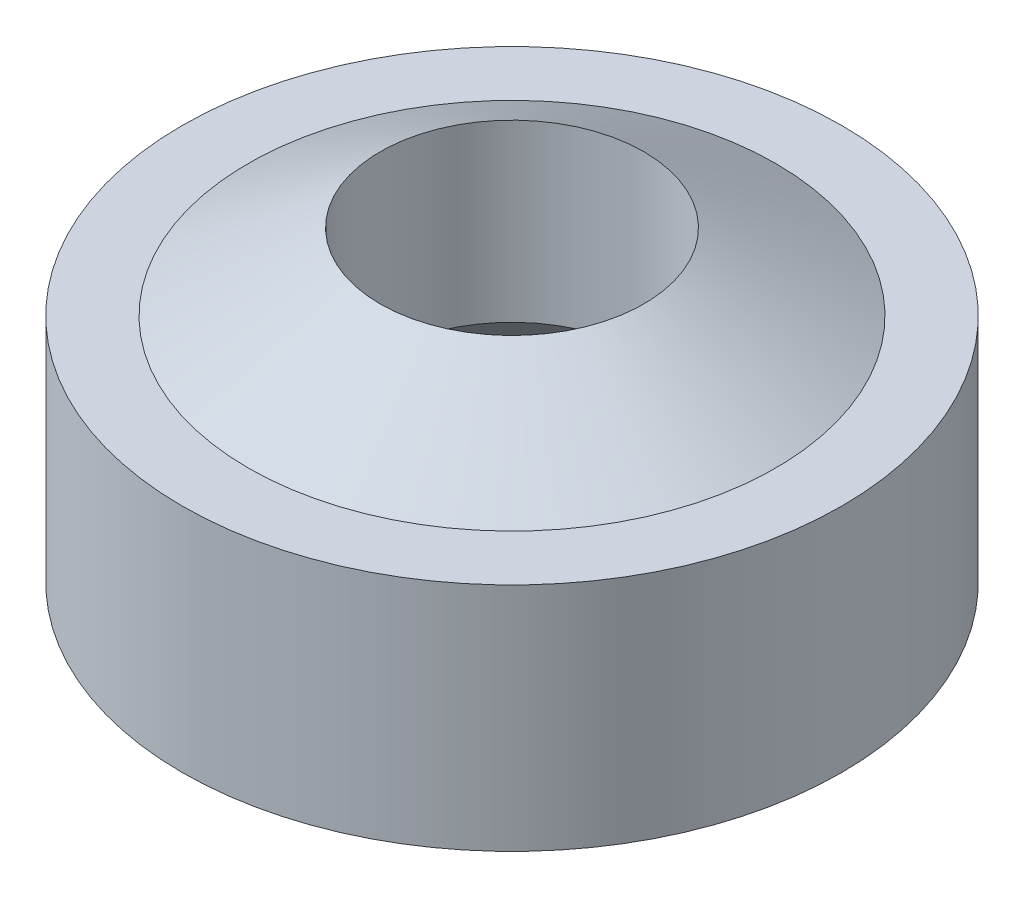
ISO-10303-21;
HEADER;
FILE_DESCRIPTION(('STEP AP214'),'2;1');
FILE_NAME('part.step','',(''),(''),'','','');
FILE_SCHEMA(('AUTOMOTIVE_DESIGN { 1 0 10303 214 1 1 1 1 }'));
ENDSEC;
DATA;
#1=APPLICATION_CONTEXT('core data for automotive mechanical design processes');
#2=APPLICATION_PROTOCOL_DEFINITION('international standard','automotive_design',2000,#1);
#3=PRODUCT_CONTEXT('',#1,'mechanical');
#4=PRODUCT('Part','Part','',(#3));
#5=PRODUCT_RELATED_PRODUCT_CATEGORY('part','',(#4));
#6=PRODUCT_DEFINITION_FORMATION('','',#4);
#7=PRODUCT_DEFINITION_CONTEXT('part definition',#1,'design');
#8=PRODUCT_DEFINITION('design','',#6,#7);
#9=PRODUCT_DEFINITION_SHAPE('','',#8);
#10=(LENGTH_UNIT() NAMED_UNIT(*) SI_UNIT(.MILLI.,.METRE.));
#11=(NAMED_UNIT(*) PLANE_ANGLE_UNIT() SI_UNIT($,.RADIAN.));
#12=(NAMED_UNIT(*) SI_UNIT($,.STERADIAN.) SOLID_ANGLE_UNIT());
#13=UNCERTAINTY_MEASURE_WITH_UNIT(LENGTH_MEASURE(1.E-05),#10,'distance_accuracy_value','');
#14=(GEOMETRIC_REPRESENTATION_CONTEXT(3) GLOBAL_UNCERTAINTY_ASSIGNED_CONTEXT((#13)) GLOBAL_UNIT_ASSIGNED_CONTEXT((#10,
#11,#12)) REPRESENTATION_CONTEXT('',''));
#15=CARTESIAN_POINT('',(0.,0.,0.));
#16=DIRECTION('',(0.,0.,1.));
#17=DIRECTION('',(1.,0.,0.));
#18=AXIS2_PLACEMENT_3D('',#15,#16,#17);
#19=CARTESIAN_POINT('',(0.,50.6240655848836,0.));
#20=DIRECTION('',(0.,1.,0.));
#21=DIRECTION('',(0.,0.,1.));
#22=AXIS2_PLACEMENT_3D('',#19,#20,#21);
#23=CYLINDRICAL_SURFACE('',#22,4.);
#24=CARTESIAN_POINT('',(0.,8.3094010767584,0.));
#25=DIRECTION('',(0.,-1.,0.));
#26=DIRECTION('',(0.,0.,-1.));
#27=AXIS2_PLACEMENT_3D('',#24,#25,#26);
#28=CIRCLE('',#27,4.);
#29=CARTESIAN_POINT('',(0.,8.3094010767584,-4.));
#30=VERTEX_POINT('',#29);
#31=EDGE_CURVE('E45',#30,#30,#28,.F.);
#32=ORIENTED_EDGE('',*,*,#31,.T.);
#33=EDGE_LOOP('',(#32));
#34=FACE_BOUND('',#33,.T.);
#35=CARTESIAN_POINT('',(0.,2.99999999999998,0.));
#36=DIRECTION('',(0.,1.,0.));
#37=DIRECTION('',(0.,0.,1.));
#38=AXIS2_PLACEMENT_3D('',#35,#36,#37);
#39=CIRCLE('',#38,4.);
#40=CARTESIAN_POINT('',(0.,2.99999999999998,4.));
#41=VERTEX_POINT('',#40);
#42=EDGE_CURVE('E49',#41,#41,#39,.T.);
#43=ORIENTED_EDGE('',*,*,#42,.F.);
#44=EDGE_LOOP('',(#43));
#45=FACE_BOUND('',#44,.T.);
#46=ADVANCED_FACE('F33',(#34,#45),#23,.F.);
#47=CARTESIAN_POINT('',(0.,2.99999999999999,0.));
#48=DIRECTION('',(0.,-1.,0.));
#49=DIRECTION('',(0.,0.,-1.));
#50=AXIS2_PLACEMENT_3D('',#47,#48,#49);
#51=PLANE('',#50);
#52=ORIENTED_EDGE('',*,*,#42,.T.);
#53=EDGE_LOOP('',(#52));
#54=FACE_BOUND('',#53,.T.);
#55=CARTESIAN_POINT('',(0.,3.,0.));
#56=DIRECTION('',(0.,1.,0.));
#57=DIRECTION('',(0.,0.,1.));
#58=AXIS2_PLACEMENT_3D('',#55,#56,#57);
#59=CIRCLE('',#58,7.);
#60=CARTESIAN_POINT('',(0.,3.,7.));
#61=VERTEX_POINT('',#60);
#62=EDGE_CURVE('E54',#61,#61,#59,.T.);
#63=ORIENTED_EDGE('',*,*,#62,.F.);
#64=EDGE_LOOP('',(#63));
#65=FACE_BOUND('',#64,.T.);
#66=ADVANCED_FACE('F83',(#54,#65),#51,.T.);
#67=CARTESIAN_POINT('',(0.,50.6240655848836,0.));
#68=DIRECTION('',(0.,1.,0.));
#69=DIRECTION('',(0.,0.,1.));
#70=AXIS2_PLACEMENT_3D('',#67,#68,#69);
#71=CYLINDRICAL_SURFACE('',#70,7.);
#72=CARTESIAN_POINT('',(0.,0.999999999999987,0.));
#73=DIRECTION('',(0.,1.,0.));
#74=DIRECTION('',(0.,0.,1.));
#75=AXIS2_PLACEMENT_3D('',#72,#73,#74);
#76=CIRCLE('',#75,7.);
#77=CARTESIAN_POINT('',(0.,0.999999999999987,7.));
#78=VERTEX_POINT('',#77);
#79=EDGE_CURVE('E10',#78,#78,#76,.F.);
#80=ORIENTED_EDGE('',*,*,#79,.T.);
#81=EDGE_LOOP('',(#80));
#82=FACE_BOUND('',#81,.T.);
#83=ORIENTED_EDGE('',*,*,#62,.T.);
#84=EDGE_LOOP('',(#83));
#85=FACE_BOUND('',#84,.T.);
#86=ADVANCED_FACE('F89',(#82,#85),#71,.F.);
#87=CARTESIAN_POINT('',(0.,-1.00000000000001,0.));
#88=DIRECTION('',(0.,1.,0.));
#89=DIRECTION('',(0.,0.,1.));
#90=AXIS2_PLACEMENT_3D('',#87,#88,#89);
#91=PLANE('',#90);
#92=CARTESIAN_POINT('',(0.,-1.00000000000001,0.));
#93=DIRECTION('',(0.,1.,0.));
#94=DIRECTION('',(0.,0.,1.));
#95=AXIS2_PLACEMENT_3D('',#92,#93,#94);
#96=CIRCLE('',#95,8.99999999999999);
#97=CARTESIAN_POINT('',(0.,-1.00000000000001,8.99999999999999));
#98=VERTEX_POINT('',#97);
#99=EDGE_CURVE('E41',#98,#98,#96,.T.);
#100=ORIENTED_EDGE('',*,*,#99,.T.);
#101=EDGE_LOOP('',(#100));
#102=FACE_BOUND('',#101,.T.);
#103=CARTESIAN_POINT('',(0.,-1.00000000000001,0.));
#104=DIRECTION('',(0.,1.,0.));
#105=DIRECTION('',(0.,0.,1.));
#106=AXIS2_PLACEMENT_3D('',#103,#104,#105);
#107=CIRCLE('',#106,10.);
#108=CARTESIAN_POINT('',(0.,-1.00000000000001,10.));
#109=VERTEX_POINT('',#108);
#110=EDGE_CURVE('E57',#109,#109,#107,.T.);
#111=ORIENTED_EDGE('',*,*,#110,.F.);
#112=EDGE_LOOP('',(#111));
#113=FACE_BOUND('',#112,.T.);
#114=ADVANCED_FACE('F79',(#102,#113),#91,.F.);
#115=CARTESIAN_POINT('',(0.,50.6240655848836,0.));
#116=DIRECTION('',(0.,1.,0.));
#117=DIRECTION('',(0.,0.,1.));
#118=AXIS2_PLACEMENT_3D('',#115,#116,#117);
#119=CYLINDRICAL_SURFACE('',#118,10.);
#120=CARTESIAN_POINT('',(0.,5.99999999999999,0.));
#121=DIRECTION('',(0.,1.,0.));
#122=DIRECTION('',(0.,0.,1.));
#123=AXIS2_PLACEMENT_3D('',#120,#121,#122);
#124=CIRCLE('',#123,10.);
#125=CARTESIAN_POINT('',(0.,5.99999999999999,10.));
#126=VERTEX_POINT('',#125);
#127=EDGE_CURVE('E60',#126,#126,#124,.T.);
#128=ORIENTED_EDGE('',*,*,#127,.F.);
#129=EDGE_LOOP('',(#128));
#130=FACE_BOUND('',#129,.T.);
#131=ORIENTED_EDGE('',*,*,#110,.T.);
#132=EDGE_LOOP('',(#131));
#133=FACE_BOUND('',#132,.T.);
#134=ADVANCED_FACE('F72',(#130,#133),#119,.T.);
#135=CARTESIAN_POINT('',(0.,5.99999999999999,0.));
#136=DIRECTION('',(0.,1.,0.));
#137=DIRECTION('',(0.,0.,1.));
#138=AXIS2_PLACEMENT_3D('',#135,#136,#137);
#139=PLANE('',#138);
#140=ORIENTED_EDGE('',*,*,#127,.T.);
#141=EDGE_LOOP('',(#140));
#142=FACE_BOUND('',#141,.T.);
#143=CARTESIAN_POINT('',(0.,5.99999999999999,0.));
#144=DIRECTION('',(0.,1.,0.));
#145=DIRECTION('',(0.,0.,1.));
#146=AXIS2_PLACEMENT_3D('',#143,#144,#145);
#147=CIRCLE('',#146,8.);
#148=CARTESIAN_POINT('',(0.,5.99999999999999,8.));
#149=VERTEX_POINT('',#148);
#150=EDGE_CURVE('E63',#149,#149,#147,.T.);
#151=ORIENTED_EDGE('',*,*,#150,.F.);
#152=EDGE_LOOP('',(#151));
#153=FACE_BOUND('',#152,.T.);
#154=ADVANCED_FACE('F70',(#142,#153),#139,.T.);
#155=CARTESIAN_POINT('',(0.,9.99999999999997,0.));
#156=DIRECTION('',(0.,-1.,0.));
#157=DIRECTION('',(0.,0.,-1.));
#158=AXIS2_PLACEMENT_3D('',#155,#156,#157);
#159=CONICAL_SURFACE('',#158,1.07179676972434,1.0471975511966);
#160=ORIENTED_EDGE('',*,*,#150,.T.);
#161=EDGE_LOOP('',(#160));
#162=FACE_BOUND('',#161,.T.);
#163=ORIENTED_EDGE('',*,*,#31,.F.);
#164=EDGE_LOOP('',(#163));
#165=FACE_BOUND('',#164,.T.);
#166=ADVANCED_FACE('F67',(#162,#165),#159,.T.);
#167=CARTESIAN_POINT('',(0.,-1.00000000000001,0.));
#168=DIRECTION('',(0.,-1.,0.));
#169=DIRECTION('',(0.,0.,-1.));
#170=AXIS2_PLACEMENT_3D('',#167,#168,#169);
#171=CONICAL_SURFACE('',#170,8.99999999999999,0.785398163397446);
#172=ORIENTED_EDGE('',*,*,#79,.F.);
#173=EDGE_LOOP('',(#172));
#174=FACE_BOUND('',#173,.T.);
#175=ORIENTED_EDGE('',*,*,#99,.F.);
#176=EDGE_LOOP('',(#175));
#177=FACE_BOUND('',#176,.T.);
#178=ADVANCED_FACE('F36',(#174,#177),#171,.F.);
#179=CLOSED_SHELL('',(#46,#66,#86,#114,#134,#154,#166,#178));
#180=MANIFOLD_SOLID_BREP('B2',#179);
#181=ADVANCED_BREP_SHAPE_REPRESENTATION('',(#18,#180),#14);
#182=SHAPE_DEFINITION_REPRESENTATION(#9,#181);
ENDSEC;
END-ISO-10303-21;
